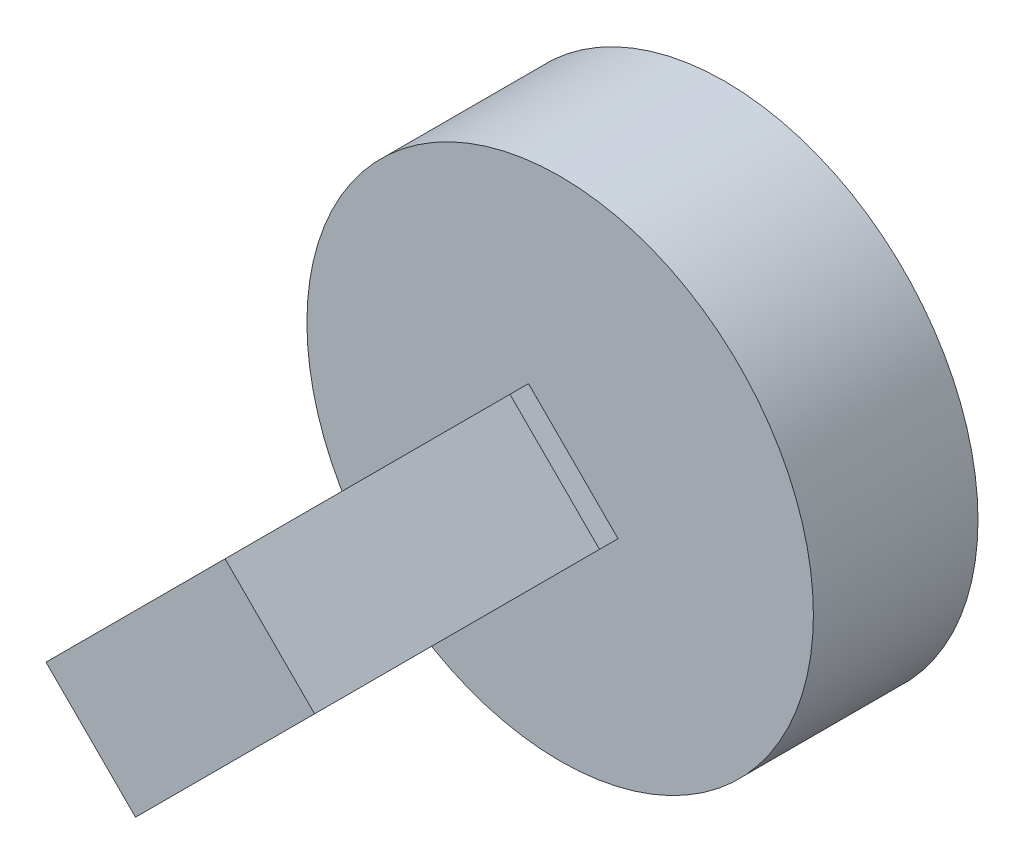
ISO-10303-21;
HEADER;
FILE_DESCRIPTION(('STEP AP214'),'2;1');
FILE_NAME('part.step','',(''),(''),'','','');
FILE_SCHEMA(('AUTOMOTIVE_DESIGN { 1 0 10303 214 1 1 1 1 }'));
ENDSEC;
DATA;
#1=APPLICATION_CONTEXT('core data for automotive mechanical design processes');
#2=APPLICATION_PROTOCOL_DEFINITION('international standard','automotive_design',2000,#1);
#3=PRODUCT_CONTEXT('',#1,'mechanical');
#4=PRODUCT('Part','Part','',(#3));
#5=PRODUCT_RELATED_PRODUCT_CATEGORY('part','',(#4));
#6=PRODUCT_DEFINITION_FORMATION('','',#4);
#7=PRODUCT_DEFINITION_CONTEXT('part definition',#1,'design');
#8=PRODUCT_DEFINITION('design','',#6,#7);
#9=PRODUCT_DEFINITION_SHAPE('','',#8);
#10=(LENGTH_UNIT() NAMED_UNIT(*) SI_UNIT(.MILLI.,.METRE.));
#11=(NAMED_UNIT(*) PLANE_ANGLE_UNIT() SI_UNIT($,.RADIAN.));
#12=(NAMED_UNIT(*) SI_UNIT($,.STERADIAN.) SOLID_ANGLE_UNIT());
#13=UNCERTAINTY_MEASURE_WITH_UNIT(LENGTH_MEASURE(1.E-05),#10,'distance_accuracy_value','');
#14=(GEOMETRIC_REPRESENTATION_CONTEXT(3) GLOBAL_UNCERTAINTY_ASSIGNED_CONTEXT((#13)) GLOBAL_UNIT_ASSIGNED_CONTEXT((#10,
#11,#12)) REPRESENTATION_CONTEXT('',''));
#15=CARTESIAN_POINT('',(0.,0.,0.));
#16=DIRECTION('',(0.,0.,1.));
#17=DIRECTION('',(1.,0.,0.));
#18=AXIS2_PLACEMENT_3D('',#15,#16,#17);
#19=CARTESIAN_POINT('',(0.,0.,26.));
#20=DIRECTION('',(0.,0.,-1.));
#21=DIRECTION('',(-1.,0.,0.));
#22=AXIS2_PLACEMENT_3D('',#19,#20,#21);
#23=CYLINDRICAL_SURFACE('',#22,40.);
#24=CARTESIAN_POINT('',(0.,0.,26.));
#25=DIRECTION('',(0.,0.,1.));
#26=DIRECTION('',(1.,0.,0.));
#27=AXIS2_PLACEMENT_3D('',#24,#25,#26);
#28=CIRCLE('',#27,40.);
#29=CARTESIAN_POINT('',(-40.,0.,26.));
#30=VERTEX_POINT('',#29);
#31=EDGE_CURVE('E11',#30,#30,#28,.T.);
#32=CARTESIAN_POINT('',(0.,0.,0.));
#33=DIRECTION('',(0.,0.,1.));
#34=DIRECTION('',(1.,0.,0.));
#35=AXIS2_PLACEMENT_3D('',#32,#33,#34);
#36=CIRCLE('',#35,40.);
#37=CARTESIAN_POINT('',(-40.,0.,0.));
#38=VERTEX_POINT('',#37);
#39=EDGE_CURVE('E40',#38,#38,#36,.T.);
#40=CARTESIAN_POINT('',(-40.,0.,26.));
#41=CARTESIAN_POINT('',(-40.,0.,25.7291666666667));
#42=CARTESIAN_POINT('',(-40.,0.,25.4583333333333));
#43=CARTESIAN_POINT('',(-40.,0.,24.9166666666667));
#44=CARTESIAN_POINT('',(-40.,0.,24.6458333333333));
#45=CARTESIAN_POINT('',(-40.,0.,24.1041666666667));
#46=CARTESIAN_POINT('',(-40.,0.,23.8333333333333));
#47=CARTESIAN_POINT('',(-40.,0.,23.2916666666667));
#48=CARTESIAN_POINT('',(-40.,0.,23.0208333333333));
#49=CARTESIAN_POINT('',(-40.,0.,22.4791666666667));
#50=CARTESIAN_POINT('',(-40.,0.,22.2083333333333));
#51=CARTESIAN_POINT('',(-40.,0.,21.6666666666667));
#52=CARTESIAN_POINT('',(-40.,0.,21.3958333333333));
#53=CARTESIAN_POINT('',(-40.,0.,20.8541666666667));
#54=CARTESIAN_POINT('',(-40.,0.,20.5833333333333));
#55=CARTESIAN_POINT('',(-40.,0.,20.0416666666667));
#56=CARTESIAN_POINT('',(-40.,0.,19.7708333333333));
#57=CARTESIAN_POINT('',(-40.,0.,19.2291666666667));
#58=CARTESIAN_POINT('',(-40.,0.,18.9583333333333));
#59=CARTESIAN_POINT('',(-40.,0.,18.4166666666667));
#60=CARTESIAN_POINT('',(-40.,0.,18.1458333333333));
#61=CARTESIAN_POINT('',(-40.,0.,17.6041666666667));
#62=CARTESIAN_POINT('',(-40.,0.,17.3333333333333));
#63=CARTESIAN_POINT('',(-40.,0.,16.7916666666667));
#64=CARTESIAN_POINT('',(-40.,0.,16.5208333333333));
#65=CARTESIAN_POINT('',(-40.,0.,15.9791666666667));
#66=CARTESIAN_POINT('',(-40.,0.,15.7083333333333));
#67=CARTESIAN_POINT('',(-40.,0.,15.1666666666667));
#68=CARTESIAN_POINT('',(-40.,0.,14.8958333333333));
#69=CARTESIAN_POINT('',(-40.,0.,14.3541666666667));
#70=CARTESIAN_POINT('',(-40.,0.,14.0833333333333));
#71=CARTESIAN_POINT('',(-40.,0.,13.5416666666667));
#72=CARTESIAN_POINT('',(-40.,0.,13.2708333333333));
#73=CARTESIAN_POINT('',(-40.,0.,12.7291666666667));
#74=CARTESIAN_POINT('',(-40.,0.,12.4583333333333));
#75=CARTESIAN_POINT('',(-40.,0.,11.9166666666667));
#76=CARTESIAN_POINT('',(-40.,0.,11.6458333333333));
#77=CARTESIAN_POINT('',(-40.,0.,11.1041666666667));
#78=CARTESIAN_POINT('',(-40.,0.,10.8333333333333));
#79=CARTESIAN_POINT('',(-40.,0.,10.2916666666667));
#80=CARTESIAN_POINT('',(-40.,0.,10.0208333333333));
#81=CARTESIAN_POINT('',(-40.,0.,9.47916666666667));
#82=CARTESIAN_POINT('',(-40.,0.,9.20833333333333));
#83=CARTESIAN_POINT('',(-40.,0.,8.66666666666667));
#84=CARTESIAN_POINT('',(-40.,0.,8.39583333333333));
#85=CARTESIAN_POINT('',(-40.,0.,7.85416666666667));
#86=CARTESIAN_POINT('',(-40.,0.,7.58333333333333));
#87=CARTESIAN_POINT('',(-40.,0.,7.04166666666667));
#88=CARTESIAN_POINT('',(-40.,0.,6.77083333333333));
#89=CARTESIAN_POINT('',(-40.,0.,6.22916666666667));
#90=CARTESIAN_POINT('',(-40.,0.,5.95833333333333));
#91=CARTESIAN_POINT('',(-40.,0.,5.41666666666667));
#92=CARTESIAN_POINT('',(-40.,0.,5.14583333333333));
#93=CARTESIAN_POINT('',(-40.,0.,4.60416666666667));
#94=CARTESIAN_POINT('',(-40.,0.,4.33333333333333));
#95=CARTESIAN_POINT('',(-40.,0.,3.79166666666667));
#96=CARTESIAN_POINT('',(-40.,0.,3.52083333333333));
#97=CARTESIAN_POINT('',(-40.,0.,2.97916666666667));
#98=CARTESIAN_POINT('',(-40.,0.,2.70833333333333));
#99=CARTESIAN_POINT('',(-40.,0.,2.16666666666667));
#100=CARTESIAN_POINT('',(-40.,0.,1.89583333333333));
#101=CARTESIAN_POINT('',(-40.,0.,1.35416666666667));
#102=CARTESIAN_POINT('',(-40.,0.,1.08333333333333));
#103=CARTESIAN_POINT('',(-40.,0.,0.541666666666667));
#104=CARTESIAN_POINT('',(-40.,0.,0.270833333333334));
#105=CARTESIAN_POINT('',(-40.,0.,0.));
#106=B_SPLINE_CURVE_WITH_KNOTS('',3,(#40,#41,#42,#43,#44,#45,#46,#47,#48,#49,#50,#51,#52,#53,
#54,#55,#56,#57,#58,#59,#60,#61,#62,#63,#64,#65,#66,#67,#68,#69,#70,#71,#72,#73,#74,#75,#76,#77,
#78,#79,#80,#81,#82,#83,#84,#85,#86,#87,#88,#89,#90,#91,#92,#93,#94,#95,#96,#97,#98,#99,#100,
#101,#102,#103,#104,#105),.UNSPECIFIED.,.F.,.F.,(4,2,2,2,2,2,2,2,2,2,2,2,2,2,2,2,2,2,2,2,2,2,2,
2,2,2,2,2,2,2,2,2,4),(0.,0.812500000000001,1.625,2.4375,3.25,4.0625,4.875,5.6875,6.5,7.3125,
8.125,8.9375,9.75,10.5625,11.375,12.1875,13.,13.8125,14.625,15.4375,16.25,17.0625,17.875,
18.6875,19.5,20.3125,21.125,21.9375,22.75,23.5625,24.375,25.1875,26.),.UNSPECIFIED.);
#107=EDGE_CURVE('BSEAM37',#30,#38,#106,.T.);
#108=ORIENTED_EDGE('',*,*,#31,.F.);
#109=ORIENTED_EDGE('',*,*,#39,.T.);
#110=ORIENTED_EDGE('',*,*,#107,.T.);
#111=ORIENTED_EDGE('',*,*,#107,.F.);
#112=EDGE_LOOP('',(#108,#110,#109,#111));
#113=FACE_BOUND('',#112,.T.);
#114=ADVANCED_FACE('F37',(#113),#23,.T.);
#115=CARTESIAN_POINT('',(0.,0.,26.));
#116=DIRECTION('',(0.,0.,1.));
#117=DIRECTION('',(1.,0.,0.));
#118=AXIS2_PLACEMENT_3D('',#115,#116,#117);
#119=PLANE('',#118);
#120=CARTESIAN_POINT('',(0.,0.,26.));
#121=DIRECTION('',(0.,0.,1.));
#122=DIRECTION('',(1.,0.,0.));
#123=AXIS2_PLACEMENT_3D('',#120,#121,#122);
#124=CIRCLE('',#123,1.5);
#125=CARTESIAN_POINT('',(1.5,0.,26.));
#126=VERTEX_POINT('',#125);
#127=EDGE_CURVE('E157',#126,#126,#124,.T.);
#128=ORIENTED_EDGE('',*,*,#127,.F.);
#129=EDGE_LOOP('',(#128));
#130=FACE_BOUND('',#129,.T.);
#131=ORIENTED_EDGE('',*,*,#31,.T.);
#132=EDGE_LOOP('',(#131));
#133=FACE_BOUND('',#132,.T.);
#134=ADVANCED_FACE('F166',(#130,#133),#119,.T.);
#135=CARTESIAN_POINT('',(0.,0.,0.));
#136=DIRECTION('',(0.,0.,1.));
#137=DIRECTION('',(1.,0.,0.));
#138=AXIS2_PLACEMENT_3D('',#135,#136,#137);
#139=PLANE('',#138);
#140=ORIENTED_EDGE('',*,*,#39,.F.);
#141=EDGE_LOOP('',(#140));
#142=FACE_BOUND('',#141,.T.);
#143=ADVANCED_FACE('F169',(#142),#139,.F.);
#144=CARTESIAN_POINT('',(0.,0.,31.));
#145=DIRECTION('',(0.,0.,-1.));
#146=DIRECTION('',(-1.,0.,0.));
#147=AXIS2_PLACEMENT_3D('',#144,#145,#146);
#148=CYLINDRICAL_SURFACE('',#147,1.5);
#149=CARTESIAN_POINT('',(0.,0.,31.));
#150=DIRECTION('',(0.,0.,1.));
#151=DIRECTION('',(1.,0.,0.));
#152=AXIS2_PLACEMENT_3D('',#149,#150,#151);
#153=CIRCLE('',#152,1.5);
#154=CARTESIAN_POINT('',(1.5,0.,31.));
#155=VERTEX_POINT('',#154);
#156=EDGE_CURVE('E158',#155,#155,#153,.T.);
#157=ORIENTED_EDGE('',*,*,#156,.F.);
#158=EDGE_LOOP('',(#157));
#159=FACE_BOUND('',#158,.T.);
#160=ORIENTED_EDGE('',*,*,#127,.T.);
#161=EDGE_LOOP('',(#160));
#162=FACE_BOUND('',#161,.T.);
#163=ADVANCED_FACE('F164',(#159,#162),#148,.T.);
#164=CARTESIAN_POINT('',(-14.14,0.,41.));
#165=DIRECTION('',(0.707106781186548,-0.707106781186548,0.));
#166=DIRECTION('',(0.707106781186548,0.707106781186548,0.));
#167=AXIS2_PLACEMENT_3D('',#164,#165,#166);
#168=PLANE('',#167);
#169=DIRECTION('',(-0.707106781186547,-0.707106781186547,0.));
#170=VECTOR('',#169,1.);
#171=CARTESIAN_POINT('',(-14.14,0.,31.));
#172=LINE('',#171,#170);
#173=CARTESIAN_POINT('',(0.,14.14,31.));
#174=VERTEX_POINT('',#173);
#175=CARTESIAN_POINT('',(-14.14,0.,31.));
#176=VERTEX_POINT('',#175);
#177=EDGE_CURVE('E134',#174,#176,#172,.T.);
#178=ORIENTED_EDGE('',*,*,#177,.T.);
#179=DIRECTION('',(0.,0.,-1.));
#180=VECTOR('',#179,1.);
#181=CARTESIAN_POINT('',(-14.14,0.,41.));
#182=LINE('',#181,#180);
#183=CARTESIAN_POINT('',(-14.14,0.,41.));
#184=VERTEX_POINT('',#183);
#185=EDGE_CURVE('E155',#184,#176,#182,.T.);
#186=ORIENTED_EDGE('',*,*,#185,.F.);
#187=DIRECTION('',(-0.707106781186547,-0.707106781186548,0.));
#188=VECTOR('',#187,1.);
#189=CARTESIAN_POINT('',(-7.07,7.07,41.));
#190=LINE('',#189,#188);
#191=CARTESIAN_POINT('',(-21.2132034355964,-7.07320343559643,41.));
#192=VERTEX_POINT('',#191);
#193=EDGE_CURVE('E379',#184,#192,#190,.T.);
#194=ORIENTED_EDGE('',*,*,#193,.T.);
#195=DIRECTION('',(0.,0.,-1.));
#196=VECTOR('',#195,1.);
#197=CARTESIAN_POINT('',(-21.2132034355964,-7.07320343559643,86.));
#198=LINE('',#197,#196);
#199=CARTESIAN_POINT('',(-21.2132034355964,-7.07320343559643,86.));
#200=VERTEX_POINT('',#199);
#201=EDGE_CURVE('E381',#200,#192,#198,.T.);
#202=ORIENTED_EDGE('',*,*,#201,.F.);
#203=DIRECTION('',(-0.707106781186547,-0.707106781186548,0.));
#204=VECTOR('',#203,1.);
#205=CARTESIAN_POINT('',(-7.07,7.07,86.));
#206=LINE('',#205,#204);
#207=CARTESIAN_POINT('',(7.07320343559642,21.2132034355964,86.));
#208=VERTEX_POINT('',#207);
#209=EDGE_CURVE('E125',#208,#200,#206,.T.);
#210=ORIENTED_EDGE('',*,*,#209,.F.);
#211=DIRECTION('',(0.,0.,-1.));
#212=VECTOR('',#211,1.);
#213=CARTESIAN_POINT('',(7.07320343559642,21.2132034355964,86.));
#214=LINE('',#213,#212);
#215=CARTESIAN_POINT('',(7.07320343559642,21.2132034355964,41.));
#216=VERTEX_POINT('',#215);
#217=EDGE_CURVE('E139',#208,#216,#214,.T.);
#218=ORIENTED_EDGE('',*,*,#217,.T.);
#219=CARTESIAN_POINT('',(0.,14.14,41.));
#220=VERTEX_POINT('',#219);
#221=EDGE_CURVE('E129',#216,#220,#190,.T.);
#222=ORIENTED_EDGE('',*,*,#221,.T.);
#223=DIRECTION('',(0.,0.,-1.));
#224=VECTOR('',#223,1.);
#225=CARTESIAN_POINT('',(0.,14.14,41.));
#226=LINE('',#225,#224);
#227=EDGE_CURVE('E146',#220,#174,#226,.T.);
#228=ORIENTED_EDGE('',*,*,#227,.T.);
#229=EDGE_LOOP('',(#178,#186,#194,#202,#210,#218,#222,#228));
#230=FACE_BOUND('',#229,.T.);
#231=ADVANCED_FACE('F182',(#230),#168,.F.);
#232=CARTESIAN_POINT('',(0.,-14.14,41.));
#233=DIRECTION('',(0.707106781186548,0.707106781186548,0.));
#234=DIRECTION('',(-0.707106781186548,0.707106781186548,0.));
#235=AXIS2_PLACEMENT_3D('',#232,#233,#234);
#236=PLANE('',#235);
#237=DIRECTION('',(0.707106781186547,-0.707106781186547,0.));
#238=VECTOR('',#237,1.);
#239=CARTESIAN_POINT('',(0.,-14.14,31.));
#240=LINE('',#239,#238);
#241=CARTESIAN_POINT('',(0.,-14.14,31.));
#242=VERTEX_POINT('',#241);
#243=EDGE_CURVE('E137',#176,#242,#240,.T.);
#244=ORIENTED_EDGE('',*,*,#243,.T.);
#245=DIRECTION('',(0.,0.,-1.));
#246=VECTOR('',#245,1.);
#247=CARTESIAN_POINT('',(0.,-14.14,41.));
#248=LINE('',#247,#246);
#249=CARTESIAN_POINT('',(0.,-14.14,41.));
#250=VERTEX_POINT('',#249);
#251=EDGE_CURVE('E153',#250,#242,#248,.T.);
#252=ORIENTED_EDGE('',*,*,#251,.F.);
#253=DIRECTION('',(0.707106781186547,-0.707106781186547,0.));
#254=VECTOR('',#253,1.);
#255=CARTESIAN_POINT('',(0.,-14.14,41.));
#256=LINE('',#255,#254);
#257=EDGE_CURVE('E80',#184,#250,#256,.T.);
#258=ORIENTED_EDGE('',*,*,#257,.F.);
#259=ORIENTED_EDGE('',*,*,#185,.T.);
#260=EDGE_LOOP('',(#244,#252,#258,#259));
#261=FACE_BOUND('',#260,.T.);
#262=ADVANCED_FACE('F188',(#261),#236,.F.);
#263=CARTESIAN_POINT('',(14.14,0.,41.));
#264=DIRECTION('',(-0.707106781186548,0.707106781186548,0.));
#265=DIRECTION('',(-0.707106781186548,-0.707106781186548,0.));
#266=AXIS2_PLACEMENT_3D('',#263,#264,#265);
#267=PLANE('',#266);
#268=DIRECTION('',(0.707106781186547,0.707106781186547,0.));
#269=VECTOR('',#268,1.);
#270=CARTESIAN_POINT('',(14.14,0.,31.));
#271=LINE('',#270,#269);
#272=CARTESIAN_POINT('',(14.14,0.,31.));
#273=VERTEX_POINT('',#272);
#274=EDGE_CURVE('E69',#242,#273,#271,.T.);
#275=ORIENTED_EDGE('',*,*,#274,.T.);
#276=DIRECTION('',(0.,0.,-1.));
#277=VECTOR('',#276,1.);
#278=CARTESIAN_POINT('',(14.14,0.,41.));
#279=LINE('',#278,#277);
#280=CARTESIAN_POINT('',(14.14,0.,41.));
#281=VERTEX_POINT('',#280);
#282=EDGE_CURVE('E53',#281,#273,#279,.T.);
#283=ORIENTED_EDGE('',*,*,#282,.F.);
#284=DIRECTION('',(0.707106781186548,0.707106781186548,0.));
#285=VECTOR('',#284,1.);
#286=CARTESIAN_POINT('',(7.07,-7.07,41.));
#287=LINE('',#286,#285);
#288=CARTESIAN_POINT('',(21.2132034355964,7.07320343559642,41.));
#289=VERTEX_POINT('',#288);
#290=EDGE_CURVE('E369',#281,#289,#287,.T.);
#291=ORIENTED_EDGE('',*,*,#290,.T.);
#292=DIRECTION('',(0.,0.,-1.));
#293=VECTOR('',#292,1.);
#294=CARTESIAN_POINT('',(21.2132034355964,7.07320343559642,86.));
#295=LINE('',#294,#293);
#296=CARTESIAN_POINT('',(21.2132034355964,7.07320343559642,86.));
#297=VERTEX_POINT('',#296);
#298=EDGE_CURVE('E116',#297,#289,#295,.T.);
#299=ORIENTED_EDGE('',*,*,#298,.F.);
#300=DIRECTION('',(0.707106781186548,0.707106781186548,0.));
#301=VECTOR('',#300,1.);
#302=CARTESIAN_POINT('',(7.07,-7.07,86.));
#303=LINE('',#302,#301);
#304=CARTESIAN_POINT('',(-7.07320343559642,-21.2132034355964,86.));
#305=VERTEX_POINT('',#304);
#306=EDGE_CURVE('E108',#305,#297,#303,.T.);
#307=ORIENTED_EDGE('',*,*,#306,.F.);
#308=DIRECTION('',(0.,0.,-1.));
#309=VECTOR('',#308,1.);
#310=CARTESIAN_POINT('',(-7.07320343559642,-21.2132034355964,86.));
#311=LINE('',#310,#309);
#312=CARTESIAN_POINT('',(-7.07320343559642,-21.2132034355964,41.));
#313=VERTEX_POINT('',#312);
#314=EDGE_CURVE('E113',#305,#313,#311,.T.);
#315=ORIENTED_EDGE('',*,*,#314,.T.);
#316=EDGE_CURVE('E373',#313,#250,#287,.T.);
#317=ORIENTED_EDGE('',*,*,#316,.T.);
#318=ORIENTED_EDGE('',*,*,#251,.T.);
#319=EDGE_LOOP('',(#275,#283,#291,#299,#307,#315,#317,#318));
#320=FACE_BOUND('',#319,.T.);
#321=ADVANCED_FACE('F110',(#320),#267,.F.);
#322=CARTESIAN_POINT('',(0.,14.14,41.));
#323=DIRECTION('',(-0.707106781186548,-0.707106781186548,0.));
#324=DIRECTION('',(0.707106781186548,-0.707106781186548,0.));
#325=AXIS2_PLACEMENT_3D('',#322,#323,#324);
#326=PLANE('',#325);
#327=DIRECTION('',(-0.707106781186547,0.707106781186547,0.));
#328=VECTOR('',#327,1.);
#329=CARTESIAN_POINT('',(0.,14.14,31.));
#330=LINE('',#329,#328);
#331=EDGE_CURVE('E74',#273,#174,#330,.T.);
#332=ORIENTED_EDGE('',*,*,#331,.T.);
#333=ORIENTED_EDGE('',*,*,#227,.F.);
#334=DIRECTION('',(-0.707106781186547,0.707106781186547,0.));
#335=VECTOR('',#334,1.);
#336=CARTESIAN_POINT('',(0.,14.14,41.));
#337=LINE('',#336,#335);
#338=EDGE_CURVE('E144',#281,#220,#337,.T.);
#339=ORIENTED_EDGE('',*,*,#338,.F.);
#340=ORIENTED_EDGE('',*,*,#282,.T.);
#341=EDGE_LOOP('',(#332,#333,#339,#340));
#342=FACE_BOUND('',#341,.T.);
#343=ADVANCED_FACE('F194',(#342),#326,.F.);
#344=CARTESIAN_POINT('',(0.,0.,31.));
#345=DIRECTION('',(0.,0.,-1.));
#346=DIRECTION('',(-1.,0.,0.));
#347=AXIS2_PLACEMENT_3D('',#344,#345,#346);
#348=PLANE('',#347);
#349=ORIENTED_EDGE('',*,*,#156,.T.);
#350=EDGE_LOOP('',(#349));
#351=FACE_BOUND('',#350,.T.);
#352=ORIENTED_EDGE('',*,*,#177,.F.);
#353=ORIENTED_EDGE('',*,*,#331,.F.);
#354=ORIENTED_EDGE('',*,*,#274,.F.);
#355=ORIENTED_EDGE('',*,*,#243,.F.);
#356=EDGE_LOOP('',(#352,#353,#354,#355));
#357=FACE_BOUND('',#356,.T.);
#358=ADVANCED_FACE('F197',(#351,#357),#348,.T.);
#359=CARTESIAN_POINT('',(0.,0.,41.));
#360=DIRECTION('',(0.,0.,1.));
#361=DIRECTION('',(1.,0.,0.));
#362=AXIS2_PLACEMENT_3D('',#359,#360,#361);
#363=PLANE('',#362);
#364=ORIENTED_EDGE('',*,*,#193,.F.);
#365=ORIENTED_EDGE('',*,*,#257,.T.);
#366=ORIENTED_EDGE('',*,*,#316,.F.);
#367=DIRECTION('',(0.707106781186548,-0.707106781186547,0.));
#368=VECTOR('',#367,1.);
#369=CARTESIAN_POINT('',(-14.1432034355964,-14.1432034355964,41.));
#370=LINE('',#369,#368);
#371=EDGE_CURVE('E133',#192,#313,#370,.T.);
#372=ORIENTED_EDGE('',*,*,#371,.F.);
#373=EDGE_LOOP('',(#364,#365,#366,#372));
#374=FACE_BOUND('',#373,.T.);
#375=ADVANCED_FACE('F200',(#374),#363,.F.);
#376=ORIENTED_EDGE('',*,*,#290,.F.);
#377=ORIENTED_EDGE('',*,*,#338,.T.);
#378=ORIENTED_EDGE('',*,*,#221,.F.);
#379=DIRECTION('',(-0.707106781186548,0.707106781186548,0.));
#380=VECTOR('',#379,1.);
#381=CARTESIAN_POINT('',(14.1432034355964,14.1432034355964,41.));
#382=LINE('',#381,#380);
#383=EDGE_CURVE('E372',#289,#216,#382,.T.);
#384=ORIENTED_EDGE('',*,*,#383,.F.);
#385=EDGE_LOOP('',(#376,#377,#378,#384));
#386=FACE_BOUND('',#385,.T.);
#387=ADVANCED_FACE('F205',(#386),#363,.F.);
#388=CARTESIAN_POINT('',(-14.1432034355964,-14.1432034355964,86.));
#389=DIRECTION('',(0.707106781186547,0.707106781186548,0.));
#390=DIRECTION('',(-0.707106781186548,0.707106781186547,0.));
#391=AXIS2_PLACEMENT_3D('',#388,#389,#390);
#392=PLANE('',#391);
#393=ORIENTED_EDGE('',*,*,#371,.T.);
#394=ORIENTED_EDGE('',*,*,#314,.F.);
#395=DIRECTION('',(0.707106781186548,-0.707106781186547,0.));
#396=VECTOR('',#395,1.);
#397=CARTESIAN_POINT('',(-14.1432034355964,-14.1432034355964,86.));
#398=LINE('',#397,#396);
#399=EDGE_CURVE('E120',#200,#305,#398,.T.);
#400=ORIENTED_EDGE('',*,*,#399,.F.);
#401=ORIENTED_EDGE('',*,*,#201,.T.);
#402=EDGE_LOOP('',(#393,#394,#400,#401));
#403=FACE_BOUND('',#402,.T.);
#404=ADVANCED_FACE('F131',(#403),#392,.F.);
#405=CARTESIAN_POINT('',(14.1432034355964,14.1432034355964,86.));
#406=DIRECTION('',(-0.707106781186548,-0.707106781186548,0.));
#407=DIRECTION('',(0.707106781186548,-0.707106781186548,0.));
#408=AXIS2_PLACEMENT_3D('',#405,#406,#407);
#409=PLANE('',#408);
#410=ORIENTED_EDGE('',*,*,#383,.T.);
#411=ORIENTED_EDGE('',*,*,#217,.F.);
#412=DIRECTION('',(-0.707106781186548,0.707106781186548,0.));
#413=VECTOR('',#412,1.);
#414=CARTESIAN_POINT('',(14.1432034355964,14.1432034355964,86.));
#415=LINE('',#414,#413);
#416=EDGE_CURVE('E119',#297,#208,#415,.T.);
#417=ORIENTED_EDGE('',*,*,#416,.F.);
#418=ORIENTED_EDGE('',*,*,#298,.T.);
#419=EDGE_LOOP('',(#410,#411,#417,#418));
#420=FACE_BOUND('',#419,.T.);
#421=ADVANCED_FACE('F204',(#420),#409,.F.);
#422=CARTESIAN_POINT('',(0.,0.,86.));
#423=DIRECTION('',(0.,0.,1.));
#424=DIRECTION('',(1.,0.,0.));
#425=AXIS2_PLACEMENT_3D('',#422,#423,#424);
#426=PLANE('',#425);
#427=ORIENTED_EDGE('',*,*,#399,.T.);
#428=ORIENTED_EDGE('',*,*,#306,.T.);
#429=ORIENTED_EDGE('',*,*,#416,.T.);
#430=ORIENTED_EDGE('',*,*,#209,.T.);
#431=EDGE_LOOP('',(#427,#428,#429,#430));
#432=FACE_BOUND('',#431,.T.);
#433=ADVANCED_FACE('F123',(#432),#426,.T.);
#434=CLOSED_SHELL('',(#114,#134,#143,#163,#231,#262,#321,#343,#358,#375,#387,#404,#421,#433));
#435=MANIFOLD_SOLID_BREP('B2',#434);
#436=ADVANCED_BREP_SHAPE_REPRESENTATION('',(#18,#435),#14);
#437=SHAPE_DEFINITION_REPRESENTATION(#9,#436);
ENDSEC;
END-ISO-10303-21;
